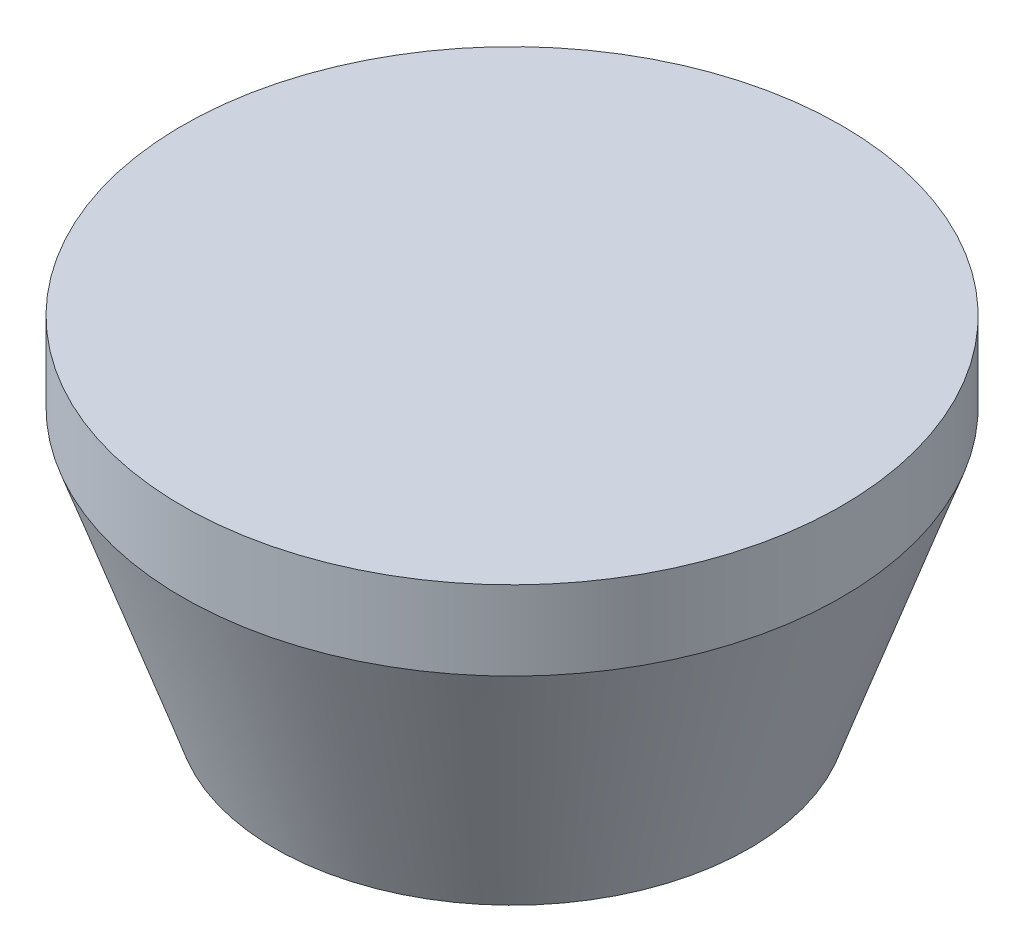
ISO-10303-21;
HEADER;
FILE_DESCRIPTION(('STEP AP214'),'2;1');
FILE_NAME('part.step','',(''),(''),'','','');
FILE_SCHEMA(('AUTOMOTIVE_DESIGN { 1 0 10303 214 1 1 1 1 }'));
ENDSEC;
DATA;
#1=APPLICATION_CONTEXT('core data for automotive mechanical design processes');
#2=APPLICATION_PROTOCOL_DEFINITION('international standard','automotive_design',2000,#1);
#3=PRODUCT_CONTEXT('',#1,'mechanical');
#4=PRODUCT('Part','Part','',(#3));
#5=PRODUCT_RELATED_PRODUCT_CATEGORY('part','',(#4));
#6=PRODUCT_DEFINITION_FORMATION('','',#4);
#7=PRODUCT_DEFINITION_CONTEXT('part definition',#1,'design');
#8=PRODUCT_DEFINITION('design','',#6,#7);
#9=PRODUCT_DEFINITION_SHAPE('','',#8);
#10=(LENGTH_UNIT() NAMED_UNIT(*) SI_UNIT(.MILLI.,.METRE.));
#11=(NAMED_UNIT(*) PLANE_ANGLE_UNIT() SI_UNIT($,.RADIAN.));
#12=(NAMED_UNIT(*) SI_UNIT($,.STERADIAN.) SOLID_ANGLE_UNIT());
#13=UNCERTAINTY_MEASURE_WITH_UNIT(LENGTH_MEASURE(1.E-05),#10,'distance_accuracy_value','');
#14=(GEOMETRIC_REPRESENTATION_CONTEXT(3) GLOBAL_UNCERTAINTY_ASSIGNED_CONTEXT((#13)) GLOBAL_UNIT_ASSIGNED_CONTEXT((#10,
#11,#12)) REPRESENTATION_CONTEXT('',''));
#15=CARTESIAN_POINT('',(0.,0.,0.));
#16=DIRECTION('',(0.,0.,1.));
#17=DIRECTION('',(1.,0.,0.));
#18=AXIS2_PLACEMENT_3D('',#15,#16,#17);
#19=CARTESIAN_POINT('',(0.,-10.,0.));
#20=DIRECTION('',(0.,-1.,0.));
#21=DIRECTION('',(1.,0.,0.));
#22=AXIS2_PLACEMENT_3D('',#19,#20,#21);
#23=SPHERICAL_SURFACE('',#22,5.);
#24=CARTESIAN_POINT('',(0.,-11.6666666666667,0.));
#25=DIRECTION('',(0.,-1.,0.));
#26=DIRECTION('',(0.,0.,-1.));
#27=AXIS2_PLACEMENT_3D('',#24,#25,#26);
#28=CIRCLE('',#27,4.71404520791032);
#29=CARTESIAN_POINT('',(0.,-11.6666666666667,-4.71404520791032));
#30=VERTEX_POINT('',#29);
#31=EDGE_CURVE('E10',#30,#30,#28,.T.);
#32=ORIENTED_EDGE('',*,*,#31,.T.);
#33=EDGE_LOOP('',(#32));
#34=FACE_BOUND('',#33,.T.);
#35=ADVANCED_FACE('F37',(#34),#23,.F.);
#36=CARTESIAN_POINT('',(0.,-12.,0.));
#37=DIRECTION('',(0.,-1.,0.));
#38=DIRECTION('',(0.,0.,-1.));
#39=AXIS2_PLACEMENT_3D('',#36,#37,#38);
#40=TOROIDAL_SURFACE('',#39,5.65685424949238,1.);
#41=CARTESIAN_POINT('',(0.,-13.,0.));
#42=DIRECTION('',(0.,-1.,0.));
#43=DIRECTION('',(0.,0.,-1.));
#44=AXIS2_PLACEMENT_3D('',#41,#42,#43);
#45=CIRCLE('',#44,5.65685424949238);
#46=CARTESIAN_POINT('',(0.,-13.,-5.65685424949238));
#47=VERTEX_POINT('',#46);
#48=EDGE_CURVE('E44',#47,#47,#45,.T.);
#49=ORIENTED_EDGE('',*,*,#48,.T.);
#50=EDGE_LOOP('',(#49));
#51=FACE_BOUND('',#50,.T.);
#52=ORIENTED_EDGE('',*,*,#31,.F.);
#53=EDGE_LOOP('',(#52));
#54=FACE_BOUND('',#53,.T.);
#55=ADVANCED_FACE('F77',(#51,#54),#40,.T.);
#56=CARTESIAN_POINT('',(9.,-13.,0.));
#57=DIRECTION('',(0.,-1.,0.));
#58=DIRECTION('',(0.,0.,-1.));
#59=AXIS2_PLACEMENT_3D('',#56,#57,#58);
#60=PLANE('',#59);
#61=CARTESIAN_POINT('',(0.,-13.,0.));
#62=DIRECTION('',(0.,-1.,0.));
#63=DIRECTION('',(0.,0.,-1.));
#64=AXIS2_PLACEMENT_3D('',#61,#62,#63);
#65=CIRCLE('',#64,9.);
#66=CARTESIAN_POINT('',(0.,-13.,-9.));
#67=VERTEX_POINT('',#66);
#68=EDGE_CURVE('E49',#67,#67,#65,.T.);
#69=ORIENTED_EDGE('',*,*,#68,.T.);
#70=EDGE_LOOP('',(#69));
#71=FACE_BOUND('',#70,.T.);
#72=ORIENTED_EDGE('',*,*,#48,.F.);
#73=EDGE_LOOP('',(#72));
#74=FACE_BOUND('',#73,.T.);
#75=ADVANCED_FACE('F81',(#71,#74),#60,.T.);
#76=CARTESIAN_POINT('',(0.,-13.,0.));
#77=DIRECTION('',(0.,1.,0.));
#78=DIRECTION('',(0.,0.,1.));
#79=AXIS2_PLACEMENT_3D('',#76,#77,#78);
#80=CONICAL_SURFACE('',#79,9.,0.336674819386727);
#81=CARTESIAN_POINT('',(0.,-3.,0.));
#82=DIRECTION('',(0.,-1.,0.));
#83=DIRECTION('',(0.,0.,-1.));
#84=AXIS2_PLACEMENT_3D('',#81,#82,#83);
#85=CIRCLE('',#84,12.5);
#86=CARTESIAN_POINT('',(0.,-3.,-12.5));
#87=VERTEX_POINT('',#86);
#88=EDGE_CURVE('E54',#87,#87,#85,.T.);
#89=ORIENTED_EDGE('',*,*,#88,.T.);
#90=EDGE_LOOP('',(#89));
#91=FACE_BOUND('',#90,.T.);
#92=ORIENTED_EDGE('',*,*,#68,.F.);
#93=EDGE_LOOP('',(#92));
#94=FACE_BOUND('',#93,.T.);
#95=ADVANCED_FACE('F74',(#91,#94),#80,.T.);
#96=CARTESIAN_POINT('',(0.,-5.,0.));
#97=DIRECTION('',(0.,-1.,0.));
#98=DIRECTION('',(0.,0.,-1.));
#99=AXIS2_PLACEMENT_3D('',#96,#97,#98);
#100=CYLINDRICAL_SURFACE('',#99,12.5);
#101=CARTESIAN_POINT('',(0.,0.,0.));
#102=DIRECTION('',(0.,-1.,0.));
#103=DIRECTION('',(0.,0.,-1.));
#104=AXIS2_PLACEMENT_3D('',#101,#102,#103);
#105=CIRCLE('',#104,12.5);
#106=CARTESIAN_POINT('',(0.,0.,-12.5));
#107=VERTEX_POINT('',#106);
#108=EDGE_CURVE('E60',#107,#107,#105,.T.);
#109=ORIENTED_EDGE('',*,*,#108,.T.);
#110=EDGE_LOOP('',(#109));
#111=FACE_BOUND('',#110,.T.);
#112=ORIENTED_EDGE('',*,*,#88,.F.);
#113=EDGE_LOOP('',(#112));
#114=FACE_BOUND('',#113,.T.);
#115=ADVANCED_FACE('F65',(#111,#114),#100,.T.);
#116=CARTESIAN_POINT('',(0.,0.,0.));
#117=DIRECTION('',(0.,1.,0.));
#118=DIRECTION('',(0.,0.,1.));
#119=AXIS2_PLACEMENT_3D('',#116,#117,#118);
#120=PLANE('',#119);
#121=ORIENTED_EDGE('',*,*,#108,.F.);
#122=EDGE_LOOP('',(#121));
#123=FACE_BOUND('',#122,.T.);
#124=ADVANCED_FACE('F68',(#123),#120,.T.);
#125=CLOSED_SHELL('',(#35,#55,#75,#95,#115,#124));
#126=MANIFOLD_SOLID_BREP('B2',#125);
#127=ADVANCED_BREP_SHAPE_REPRESENTATION('',(#18,#126),#14);
#128=SHAPE_DEFINITION_REPRESENTATION(#9,#127);
ENDSEC;
END-ISO-10303-21;
